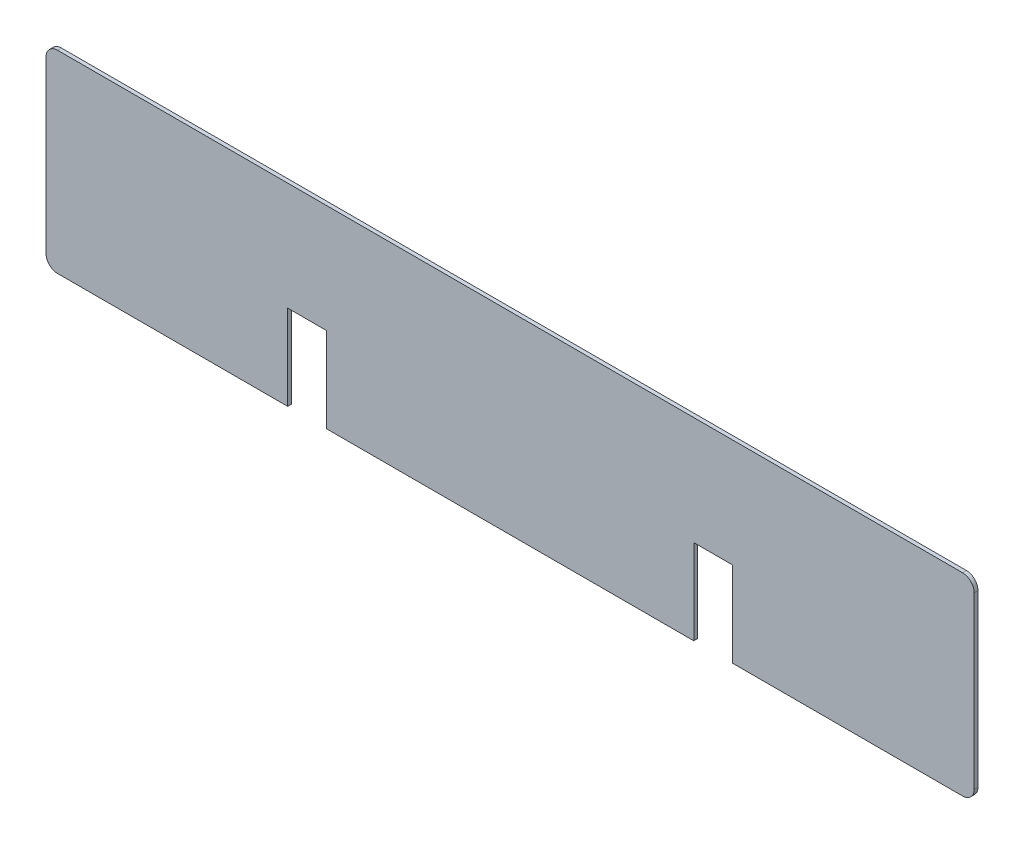
ISO-10303-21;
HEADER;
FILE_DESCRIPTION(('STEP AP214'),'2;1');
FILE_NAME('part.step','',(''),(''),'','','');
FILE_SCHEMA(('AUTOMOTIVE_DESIGN { 1 0 10303 214 1 1 1 1 }'));
ENDSEC;
DATA;
#1=APPLICATION_CONTEXT('core data for automotive mechanical design processes');
#2=APPLICATION_PROTOCOL_DEFINITION('international standard','automotive_design',2000,#1);
#3=PRODUCT_CONTEXT('',#1,'mechanical');
#4=PRODUCT('Part','Part','',(#3));
#5=PRODUCT_RELATED_PRODUCT_CATEGORY('part','',(#4));
#6=PRODUCT_DEFINITION_FORMATION('','',#4);
#7=PRODUCT_DEFINITION_CONTEXT('part definition',#1,'design');
#8=PRODUCT_DEFINITION('design','',#6,#7);
#9=PRODUCT_DEFINITION_SHAPE('','',#8);
#10=(LENGTH_UNIT() NAMED_UNIT(*) SI_UNIT(.MILLI.,.METRE.));
#11=(NAMED_UNIT(*) PLANE_ANGLE_UNIT() SI_UNIT($,.RADIAN.));
#12=(NAMED_UNIT(*) SI_UNIT($,.STERADIAN.) SOLID_ANGLE_UNIT());
#13=UNCERTAINTY_MEASURE_WITH_UNIT(LENGTH_MEASURE(1.E-05),#10,'distance_accuracy_value','');
#14=(GEOMETRIC_REPRESENTATION_CONTEXT(3) GLOBAL_UNCERTAINTY_ASSIGNED_CONTEXT((#13)) GLOBAL_UNIT_ASSIGNED_CONTEXT((#10,
#11,#12)) REPRESENTATION_CONTEXT('',''));
#15=CARTESIAN_POINT('',(0.,0.,0.));
#16=DIRECTION('',(0.,0.,1.));
#17=DIRECTION('',(1.,0.,0.));
#18=AXIS2_PLACEMENT_3D('',#15,#16,#17);
#19=CARTESIAN_POINT('',(-120.,-25.,1.));
#20=DIRECTION('',(0.,1.,0.));
#21=DIRECTION('',(0.,0.,1.));
#22=AXIS2_PLACEMENT_3D('',#19,#20,#21);
#23=PLANE('',#22);
#24=DIRECTION('',(1.,0.,0.));
#25=VECTOR('',#24,1.);
#26=CARTESIAN_POINT('',(-120.,-25.,1.));
#27=LINE('',#26,#25);
#28=CARTESIAN_POINT('',(-47.5,-25.,1.));
#29=VERTEX_POINT('',#28);
#30=CARTESIAN_POINT('',(47.5,-25.,1.));
#31=VERTEX_POINT('',#30);
#32=EDGE_CURVE('E227',#29,#31,#27,.T.);
#33=ORIENTED_EDGE('',*,*,#32,.F.);
#34=DIRECTION('',(0.,0.,1.));
#35=VECTOR('',#34,1.);
#36=CARTESIAN_POINT('',(-47.5,-25.,0.));
#37=LINE('',#36,#35);
#38=CARTESIAN_POINT('',(-47.5,-25.,0.));
#39=VERTEX_POINT('',#38);
#40=EDGE_CURVE('E182',#39,#29,#37,.T.);
#41=ORIENTED_EDGE('',*,*,#40,.F.);
#42=DIRECTION('',(1.,0.,0.));
#43=VECTOR('',#42,1.);
#44=CARTESIAN_POINT('',(-120.,-25.,0.));
#45=LINE('',#44,#43);
#46=CARTESIAN_POINT('',(47.5,-25.,0.));
#47=VERTEX_POINT('',#46);
#48=EDGE_CURVE('E172',#39,#47,#45,.T.);
#49=ORIENTED_EDGE('',*,*,#48,.T.);
#50=DIRECTION('',(0.,0.,1.));
#51=VECTOR('',#50,1.);
#52=CARTESIAN_POINT('',(47.5,-25.,0.));
#53=LINE('',#52,#51);
#54=EDGE_CURVE('E193',#47,#31,#53,.T.);
#55=ORIENTED_EDGE('',*,*,#54,.T.);
#56=EDGE_LOOP('',(#33,#41,#49,#55));
#57=FACE_BOUND('',#56,.T.);
#58=ADVANCED_FACE('F40',(#57),#23,.F.);
#59=CARTESIAN_POINT('',(57.5,-25.,1.));
#60=VERTEX_POINT('',#59);
#61=CARTESIAN_POINT('',(117.,-25.,1.));
#62=VERTEX_POINT('',#61);
#63=EDGE_CURVE('E222',#60,#62,#27,.T.);
#64=ORIENTED_EDGE('',*,*,#63,.F.);
#65=DIRECTION('',(0.,0.,1.));
#66=VECTOR('',#65,1.);
#67=CARTESIAN_POINT('',(57.5,-25.,0.));
#68=LINE('',#67,#66);
#69=CARTESIAN_POINT('',(57.5,-25.,0.));
#70=VERTEX_POINT('',#69);
#71=EDGE_CURVE('E196',#70,#60,#68,.T.);
#72=ORIENTED_EDGE('',*,*,#71,.F.);
#73=CARTESIAN_POINT('',(117.,-25.,0.));
#74=VERTEX_POINT('',#73);
#75=EDGE_CURVE('E236',#70,#74,#45,.T.);
#76=ORIENTED_EDGE('',*,*,#75,.T.);
#77=DIRECTION('',(0.,0.,-1.));
#78=VECTOR('',#77,1.);
#79=CARTESIAN_POINT('',(117.,-25.,1.));
#80=LINE('',#79,#78);
#81=EDGE_CURVE('E255',#74,#62,#80,.F.);
#82=ORIENTED_EDGE('',*,*,#81,.T.);
#83=EDGE_LOOP('',(#64,#72,#76,#82));
#84=FACE_BOUND('',#83,.T.);
#85=ADVANCED_FACE('F319',(#84),#23,.F.);
#86=CARTESIAN_POINT('',(120.,25.,1.));
#87=DIRECTION('',(-1.,0.,0.));
#88=DIRECTION('',(0.,0.,1.));
#89=AXIS2_PLACEMENT_3D('',#86,#87,#88);
#90=PLANE('',#89);
#91=DIRECTION('',(0.,1.,0.));
#92=VECTOR('',#91,1.);
#93=CARTESIAN_POINT('',(120.,25.,1.));
#94=LINE('',#93,#92);
#95=CARTESIAN_POINT('',(120.,-22.,1.));
#96=VERTEX_POINT('',#95);
#97=CARTESIAN_POINT('',(120.,22.,1.));
#98=VERTEX_POINT('',#97);
#99=EDGE_CURVE('E212',#96,#98,#94,.T.);
#100=ORIENTED_EDGE('',*,*,#99,.F.);
#101=DIRECTION('',(0.,0.,-1.));
#102=VECTOR('',#101,1.);
#103=CARTESIAN_POINT('',(120.,-22.,1.));
#104=LINE('',#103,#102);
#105=CARTESIAN_POINT('',(120.,-22.,0.));
#106=VERTEX_POINT('',#105);
#107=EDGE_CURVE('E240',#96,#106,#104,.T.);
#108=ORIENTED_EDGE('',*,*,#107,.T.);
#109=DIRECTION('',(0.,1.,0.));
#110=VECTOR('',#109,1.);
#111=CARTESIAN_POINT('',(120.,25.,0.));
#112=LINE('',#111,#110);
#113=CARTESIAN_POINT('',(120.,22.,0.));
#114=VERTEX_POINT('',#113);
#115=EDGE_CURVE('E184',#106,#114,#112,.T.);
#116=ORIENTED_EDGE('',*,*,#115,.T.);
#117=DIRECTION('',(0.,0.,-1.));
#118=VECTOR('',#117,1.);
#119=CARTESIAN_POINT('',(120.,22.,1.));
#120=LINE('',#119,#118);
#121=EDGE_CURVE('E226',#114,#98,#120,.F.);
#122=ORIENTED_EDGE('',*,*,#121,.T.);
#123=EDGE_LOOP('',(#100,#108,#116,#122));
#124=FACE_BOUND('',#123,.T.);
#125=ADVANCED_FACE('F301',(#124),#90,.F.);
#126=CARTESIAN_POINT('',(-120.,25.,1.));
#127=DIRECTION('',(0.,-1.,0.));
#128=DIRECTION('',(0.,0.,-1.));
#129=AXIS2_PLACEMENT_3D('',#126,#127,#128);
#130=PLANE('',#129);
#131=DIRECTION('',(-1.,0.,0.));
#132=VECTOR('',#131,1.);
#133=CARTESIAN_POINT('',(-120.,25.,1.));
#134=LINE('',#133,#132);
#135=CARTESIAN_POINT('',(117.,25.,1.));
#136=VERTEX_POINT('',#135);
#137=CARTESIAN_POINT('',(-117.,25.,1.));
#138=VERTEX_POINT('',#137);
#139=EDGE_CURVE('E215',#136,#138,#134,.T.);
#140=ORIENTED_EDGE('',*,*,#139,.F.);
#141=DIRECTION('',(0.,0.,-1.));
#142=VECTOR('',#141,1.);
#143=CARTESIAN_POINT('',(117.,25.,1.));
#144=LINE('',#143,#142);
#145=CARTESIAN_POINT('',(117.,25.,0.));
#146=VERTEX_POINT('',#145);
#147=EDGE_CURVE('E268',#136,#146,#144,.T.);
#148=ORIENTED_EDGE('',*,*,#147,.T.);
#149=DIRECTION('',(-1.,0.,0.));
#150=VECTOR('',#149,1.);
#151=CARTESIAN_POINT('',(-120.,25.,0.));
#152=LINE('',#151,#150);
#153=CARTESIAN_POINT('',(-117.,25.,0.));
#154=VERTEX_POINT('',#153);
#155=EDGE_CURVE('E230',#146,#154,#152,.T.);
#156=ORIENTED_EDGE('',*,*,#155,.T.);
#157=DIRECTION('',(0.,0.,-1.));
#158=VECTOR('',#157,1.);
#159=CARTESIAN_POINT('',(-117.,25.,1.));
#160=LINE('',#159,#158);
#161=EDGE_CURVE('E266',#154,#138,#160,.F.);
#162=ORIENTED_EDGE('',*,*,#161,.T.);
#163=EDGE_LOOP('',(#140,#148,#156,#162));
#164=FACE_BOUND('',#163,.T.);
#165=ADVANCED_FACE('F294',(#164),#130,.F.);
#166=CARTESIAN_POINT('',(-120.,25.,1.));
#167=DIRECTION('',(1.,0.,0.));
#168=DIRECTION('',(0.,0.,-1.));
#169=AXIS2_PLACEMENT_3D('',#166,#167,#168);
#170=PLANE('',#169);
#171=DIRECTION('',(0.,-1.,0.));
#172=VECTOR('',#171,1.);
#173=CARTESIAN_POINT('',(-120.,25.,0.));
#174=LINE('',#173,#172);
#175=CARTESIAN_POINT('',(-120.,22.,0.));
#176=VERTEX_POINT('',#175);
#177=CARTESIAN_POINT('',(-120.,-22.,0.));
#178=VERTEX_POINT('',#177);
#179=EDGE_CURVE('E233',#176,#178,#174,.T.);
#180=ORIENTED_EDGE('',*,*,#179,.T.);
#181=DIRECTION('',(0.,0.,-1.));
#182=VECTOR('',#181,1.);
#183=CARTESIAN_POINT('',(-120.,-22.,1.));
#184=LINE('',#183,#182);
#185=CARTESIAN_POINT('',(-120.,-22.,1.));
#186=VERTEX_POINT('',#185);
#187=EDGE_CURVE('E11',#178,#186,#184,.F.);
#188=ORIENTED_EDGE('',*,*,#187,.T.);
#189=DIRECTION('',(0.,-1.,0.));
#190=VECTOR('',#189,1.);
#191=CARTESIAN_POINT('',(-120.,25.,1.));
#192=LINE('',#191,#190);
#193=CARTESIAN_POINT('',(-120.,22.,1.));
#194=VERTEX_POINT('',#193);
#195=EDGE_CURVE('E219',#194,#186,#192,.T.);
#196=ORIENTED_EDGE('',*,*,#195,.F.);
#197=DIRECTION('',(0.,0.,-1.));
#198=VECTOR('',#197,1.);
#199=CARTESIAN_POINT('',(-120.,22.,1.));
#200=LINE('',#199,#198);
#201=EDGE_CURVE('E48',#194,#176,#200,.T.);
#202=ORIENTED_EDGE('',*,*,#201,.T.);
#203=EDGE_LOOP('',(#180,#188,#196,#202));
#204=FACE_BOUND('',#203,.T.);
#205=ADVANCED_FACE('F275',(#204),#170,.F.);
#206=CARTESIAN_POINT('',(-117.,-25.,0.));
#207=VERTEX_POINT('',#206);
#208=CARTESIAN_POINT('',(-57.5,-25.,0.));
#209=VERTEX_POINT('',#208);
#210=EDGE_CURVE('E216',#207,#209,#45,.T.);
#211=ORIENTED_EDGE('',*,*,#210,.T.);
#212=DIRECTION('',(0.,0.,1.));
#213=VECTOR('',#212,1.);
#214=CARTESIAN_POINT('',(-57.5,-25.,0.));
#215=LINE('',#214,#213);
#216=CARTESIAN_POINT('',(-57.5,-25.,1.));
#217=VERTEX_POINT('',#216);
#218=EDGE_CURVE('E185',#209,#217,#215,.T.);
#219=ORIENTED_EDGE('',*,*,#218,.T.);
#220=CARTESIAN_POINT('',(-117.,-25.,1.));
#221=VERTEX_POINT('',#220);
#222=EDGE_CURVE('E223',#221,#217,#27,.T.);
#223=ORIENTED_EDGE('',*,*,#222,.F.);
#224=DIRECTION('',(0.,0.,-1.));
#225=VECTOR('',#224,1.);
#226=CARTESIAN_POINT('',(-117.,-25.,1.));
#227=LINE('',#226,#225);
#228=EDGE_CURVE('E252',#221,#207,#227,.T.);
#229=ORIENTED_EDGE('',*,*,#228,.T.);
#230=EDGE_LOOP('',(#211,#219,#223,#229));
#231=FACE_BOUND('',#230,.T.);
#232=ADVANCED_FACE('F287',(#231),#23,.F.);
#233=CARTESIAN_POINT('',(0.,0.,1.));
#234=DIRECTION('',(0.,0.,1.));
#235=DIRECTION('',(1.,0.,0.));
#236=AXIS2_PLACEMENT_3D('',#233,#234,#235);
#237=PLANE('',#236);
#238=DIRECTION('',(0.,1.,0.));
#239=VECTOR('',#238,1.);
#240=CARTESIAN_POINT('',(-47.5,-3.,1.));
#241=LINE('',#240,#239);
#242=CARTESIAN_POINT('',(-47.5,-3.,1.));
#243=VERTEX_POINT('',#242);
#244=EDGE_CURVE('E158',#29,#243,#241,.T.);
#245=ORIENTED_EDGE('',*,*,#244,.F.);
#246=ORIENTED_EDGE('',*,*,#32,.T.);
#247=DIRECTION('',(0.,-1.,0.));
#248=VECTOR('',#247,1.);
#249=CARTESIAN_POINT('',(47.5,-3.,1.));
#250=LINE('',#249,#248);
#251=CARTESIAN_POINT('',(47.5,-3.,1.));
#252=VERTEX_POINT('',#251);
#253=EDGE_CURVE('E198',#252,#31,#250,.T.);
#254=ORIENTED_EDGE('',*,*,#253,.F.);
#255=DIRECTION('',(-1.,0.,0.));
#256=VECTOR('',#255,1.);
#257=CARTESIAN_POINT('',(47.5,-3.,1.));
#258=LINE('',#257,#256);
#259=CARTESIAN_POINT('',(57.5,-3.,1.));
#260=VERTEX_POINT('',#259);
#261=EDGE_CURVE('E200',#260,#252,#258,.T.);
#262=ORIENTED_EDGE('',*,*,#261,.F.);
#263=DIRECTION('',(0.,1.,0.));
#264=VECTOR('',#263,1.);
#265=CARTESIAN_POINT('',(57.5,-3.,1.));
#266=LINE('',#265,#264);
#267=EDGE_CURVE('E180',#60,#260,#266,.T.);
#268=ORIENTED_EDGE('',*,*,#267,.F.);
#269=ORIENTED_EDGE('',*,*,#63,.T.);
#270=CARTESIAN_POINT('',(117.,-22.,1.));
#271=DIRECTION('',(0.,0.,1.));
#272=DIRECTION('',(1.,0.,0.));
#273=AXIS2_PLACEMENT_3D('',#270,#271,#272);
#274=CIRCLE('',#273,3.);
#275=EDGE_CURVE('E264',#62,#96,#274,.T.);
#276=ORIENTED_EDGE('',*,*,#275,.T.);
#277=ORIENTED_EDGE('',*,*,#99,.T.);
#278=CARTESIAN_POINT('',(117.,22.,1.));
#279=DIRECTION('',(0.,0.,1.));
#280=DIRECTION('',(1.,0.,0.));
#281=AXIS2_PLACEMENT_3D('',#278,#279,#280);
#282=CIRCLE('',#281,3.);
#283=EDGE_CURVE('E262',#98,#136,#282,.T.);
#284=ORIENTED_EDGE('',*,*,#283,.T.);
#285=ORIENTED_EDGE('',*,*,#139,.T.);
#286=CARTESIAN_POINT('',(-117.,22.,1.));
#287=DIRECTION('',(0.,0.,1.));
#288=DIRECTION('',(1.,0.,0.));
#289=AXIS2_PLACEMENT_3D('',#286,#287,#288);
#290=CIRCLE('',#289,3.);
#291=EDGE_CURVE('E258',#138,#194,#290,.T.);
#292=ORIENTED_EDGE('',*,*,#291,.T.);
#293=ORIENTED_EDGE('',*,*,#195,.T.);
#294=CARTESIAN_POINT('',(-117.,-22.,1.));
#295=DIRECTION('',(0.,0.,1.));
#296=DIRECTION('',(1.,0.,0.));
#297=AXIS2_PLACEMENT_3D('',#294,#295,#296);
#298=CIRCLE('',#297,3.);
#299=EDGE_CURVE('E260',#186,#221,#298,.T.);
#300=ORIENTED_EDGE('',*,*,#299,.T.);
#301=ORIENTED_EDGE('',*,*,#222,.T.);
#302=DIRECTION('',(0.,-1.,0.));
#303=VECTOR('',#302,1.);
#304=CARTESIAN_POINT('',(-57.5,-3.,1.));
#305=LINE('',#304,#303);
#306=CARTESIAN_POINT('',(-57.5,-3.,1.));
#307=VERTEX_POINT('',#306);
#308=EDGE_CURVE('E173',#307,#217,#305,.T.);
#309=ORIENTED_EDGE('',*,*,#308,.F.);
#310=DIRECTION('',(-1.,0.,0.));
#311=VECTOR('',#310,1.);
#312=CARTESIAN_POINT('',(-57.5,-3.,1.));
#313=LINE('',#312,#311);
#314=EDGE_CURVE('E175',#243,#307,#313,.T.);
#315=ORIENTED_EDGE('',*,*,#314,.F.);
#316=EDGE_LOOP('',(#245,#246,#254,#262,#268,#269,#276,#277,#284,#285,#292,#293,#300,#301,#309,#315));
#317=FACE_BOUND('',#316,.T.);
#318=ADVANCED_FACE('F290',(#317),#237,.T.);
#319=CARTESIAN_POINT('',(0.,0.,0.));
#320=DIRECTION('',(0.,0.,1.));
#321=DIRECTION('',(1.,0.,0.));
#322=AXIS2_PLACEMENT_3D('',#319,#320,#321);
#323=PLANE('',#322);
#324=ORIENTED_EDGE('',*,*,#48,.F.);
#325=DIRECTION('',(0.,1.,0.));
#326=VECTOR('',#325,1.);
#327=CARTESIAN_POINT('',(-47.5,-3.,0.));
#328=LINE('',#327,#326);
#329=CARTESIAN_POINT('',(-47.5,-3.,0.));
#330=VERTEX_POINT('',#329);
#331=EDGE_CURVE('E155',#39,#330,#328,.T.);
#332=ORIENTED_EDGE('',*,*,#331,.T.);
#333=DIRECTION('',(-1.,0.,0.));
#334=VECTOR('',#333,1.);
#335=CARTESIAN_POINT('',(-57.5,-3.,0.));
#336=LINE('',#335,#334);
#337=CARTESIAN_POINT('',(-57.5,-3.,0.));
#338=VERTEX_POINT('',#337);
#339=EDGE_CURVE('E165',#330,#338,#336,.T.);
#340=ORIENTED_EDGE('',*,*,#339,.T.);
#341=DIRECTION('',(0.,-1.,0.));
#342=VECTOR('',#341,1.);
#343=CARTESIAN_POINT('',(-57.5,-3.,0.));
#344=LINE('',#343,#342);
#345=EDGE_CURVE('E55',#338,#209,#344,.T.);
#346=ORIENTED_EDGE('',*,*,#345,.T.);
#347=ORIENTED_EDGE('',*,*,#210,.F.);
#348=CARTESIAN_POINT('',(-117.,-22.,0.));
#349=DIRECTION('',(0.,0.,1.));
#350=DIRECTION('',(1.,0.,0.));
#351=AXIS2_PLACEMENT_3D('',#348,#349,#350);
#352=CIRCLE('',#351,3.);
#353=EDGE_CURVE('E245',#207,#178,#352,.F.);
#354=ORIENTED_EDGE('',*,*,#353,.T.);
#355=ORIENTED_EDGE('',*,*,#179,.F.);
#356=CARTESIAN_POINT('',(-117.,22.,0.));
#357=DIRECTION('',(0.,0.,1.));
#358=DIRECTION('',(1.,0.,0.));
#359=AXIS2_PLACEMENT_3D('',#356,#357,#358);
#360=CIRCLE('',#359,3.);
#361=EDGE_CURVE('E243',#176,#154,#360,.F.);
#362=ORIENTED_EDGE('',*,*,#361,.T.);
#363=ORIENTED_EDGE('',*,*,#155,.F.);
#364=CARTESIAN_POINT('',(117.,22.,0.));
#365=DIRECTION('',(0.,0.,1.));
#366=DIRECTION('',(1.,0.,0.));
#367=AXIS2_PLACEMENT_3D('',#364,#365,#366);
#368=CIRCLE('',#367,3.);
#369=EDGE_CURVE('E247',#146,#114,#368,.F.);
#370=ORIENTED_EDGE('',*,*,#369,.T.);
#371=ORIENTED_EDGE('',*,*,#115,.F.);
#372=CARTESIAN_POINT('',(117.,-22.,0.));
#373=DIRECTION('',(0.,0.,1.));
#374=DIRECTION('',(1.,0.,0.));
#375=AXIS2_PLACEMENT_3D('',#372,#373,#374);
#376=CIRCLE('',#375,3.);
#377=EDGE_CURVE('E249',#106,#74,#376,.F.);
#378=ORIENTED_EDGE('',*,*,#377,.T.);
#379=ORIENTED_EDGE('',*,*,#75,.F.);
#380=DIRECTION('',(0.,1.,0.));
#381=VECTOR('',#380,1.);
#382=CARTESIAN_POINT('',(57.5,-3.,0.));
#383=LINE('',#382,#381);
#384=CARTESIAN_POINT('',(57.5,-3.,0.));
#385=VERTEX_POINT('',#384);
#386=EDGE_CURVE('E201',#70,#385,#383,.T.);
#387=ORIENTED_EDGE('',*,*,#386,.T.);
#388=DIRECTION('',(-1.,0.,0.));
#389=VECTOR('',#388,1.);
#390=CARTESIAN_POINT('',(47.5,-3.,0.));
#391=LINE('',#390,#389);
#392=CARTESIAN_POINT('',(47.5,-3.,0.));
#393=VERTEX_POINT('',#392);
#394=EDGE_CURVE('E207',#385,#393,#391,.T.);
#395=ORIENTED_EDGE('',*,*,#394,.T.);
#396=DIRECTION('',(0.,-1.,0.));
#397=VECTOR('',#396,1.);
#398=CARTESIAN_POINT('',(47.5,-3.,0.));
#399=LINE('',#398,#397);
#400=EDGE_CURVE('E63',#393,#47,#399,.T.);
#401=ORIENTED_EDGE('',*,*,#400,.T.);
#402=EDGE_LOOP('',(#324,#332,#340,#346,#347,#354,#355,#362,#363,#370,#371,#378,#379,#387,#395,#401));
#403=FACE_BOUND('',#402,.T.);
#404=ADVANCED_FACE('F170',(#403),#323,.F.);
#405=CARTESIAN_POINT('',(117.,-22.,1.));
#406=DIRECTION('',(0.,0.,-1.));
#407=DIRECTION('',(-1.,0.,0.));
#408=AXIS2_PLACEMENT_3D('',#405,#406,#407);
#409=CYLINDRICAL_SURFACE('',#408,3.);
#410=ORIENTED_EDGE('',*,*,#275,.F.);
#411=ORIENTED_EDGE('',*,*,#81,.F.);
#412=ORIENTED_EDGE('',*,*,#377,.F.);
#413=ORIENTED_EDGE('',*,*,#107,.F.);
#414=EDGE_LOOP('',(#410,#411,#412,#413));
#415=FACE_BOUND('',#414,.T.);
#416=ADVANCED_FACE('F307',(#415),#409,.T.);
#417=CARTESIAN_POINT('',(117.,22.,1.));
#418=DIRECTION('',(0.,0.,-1.));
#419=DIRECTION('',(-1.,0.,0.));
#420=AXIS2_PLACEMENT_3D('',#417,#418,#419);
#421=CYLINDRICAL_SURFACE('',#420,3.);
#422=ORIENTED_EDGE('',*,*,#283,.F.);
#423=ORIENTED_EDGE('',*,*,#121,.F.);
#424=ORIENTED_EDGE('',*,*,#369,.F.);
#425=ORIENTED_EDGE('',*,*,#147,.F.);
#426=EDGE_LOOP('',(#422,#423,#424,#425));
#427=FACE_BOUND('',#426,.T.);
#428=ADVANCED_FACE('F304',(#427),#421,.T.);
#429=CARTESIAN_POINT('',(-117.,-22.,1.));
#430=DIRECTION('',(0.,0.,-1.));
#431=DIRECTION('',(-1.,0.,0.));
#432=AXIS2_PLACEMENT_3D('',#429,#430,#431);
#433=CYLINDRICAL_SURFACE('',#432,3.);
#434=ORIENTED_EDGE('',*,*,#299,.F.);
#435=ORIENTED_EDGE('',*,*,#187,.F.);
#436=ORIENTED_EDGE('',*,*,#353,.F.);
#437=ORIENTED_EDGE('',*,*,#228,.F.);
#438=EDGE_LOOP('',(#434,#435,#436,#437));
#439=FACE_BOUND('',#438,.T.);
#440=ADVANCED_FACE('F284',(#439),#433,.T.);
#441=CARTESIAN_POINT('',(-117.,22.,1.));
#442=DIRECTION('',(0.,0.,-1.));
#443=DIRECTION('',(-1.,0.,0.));
#444=AXIS2_PLACEMENT_3D('',#441,#442,#443);
#445=CYLINDRICAL_SURFACE('',#444,3.);
#446=ORIENTED_EDGE('',*,*,#291,.F.);
#447=ORIENTED_EDGE('',*,*,#161,.F.);
#448=ORIENTED_EDGE('',*,*,#361,.F.);
#449=ORIENTED_EDGE('',*,*,#201,.F.);
#450=EDGE_LOOP('',(#446,#447,#448,#449));
#451=FACE_BOUND('',#450,.T.);
#452=ADVANCED_FACE('F42',(#451),#445,.T.);
#453=CARTESIAN_POINT('',(57.5,-3.,0.));
#454=DIRECTION('',(1.,0.,0.));
#455=DIRECTION('',(0.,0.,-1.));
#456=AXIS2_PLACEMENT_3D('',#453,#454,#455);
#457=PLANE('',#456);
#458=ORIENTED_EDGE('',*,*,#267,.T.);
#459=DIRECTION('',(0.,0.,1.));
#460=VECTOR('',#459,1.);
#461=CARTESIAN_POINT('',(57.5,-3.,0.));
#462=LINE('',#461,#460);
#463=EDGE_CURVE('E189',#385,#260,#462,.T.);
#464=ORIENTED_EDGE('',*,*,#463,.F.);
#465=ORIENTED_EDGE('',*,*,#386,.F.);
#466=ORIENTED_EDGE('',*,*,#71,.T.);
#467=EDGE_LOOP('',(#458,#464,#465,#466));
#468=FACE_BOUND('',#467,.T.);
#469=ADVANCED_FACE('F348',(#468),#457,.F.);
#470=CARTESIAN_POINT('',(47.5,-3.,0.));
#471=DIRECTION('',(-1.,0.,0.));
#472=DIRECTION('',(0.,0.,1.));
#473=AXIS2_PLACEMENT_3D('',#470,#471,#472);
#474=PLANE('',#473);
#475=ORIENTED_EDGE('',*,*,#253,.T.);
#476=ORIENTED_EDGE('',*,*,#54,.F.);
#477=ORIENTED_EDGE('',*,*,#400,.F.);
#478=DIRECTION('',(0.,0.,1.));
#479=VECTOR('',#478,1.);
#480=CARTESIAN_POINT('',(47.5,-3.,0.));
#481=LINE('',#480,#479);
#482=EDGE_CURVE('E191',#393,#252,#481,.T.);
#483=ORIENTED_EDGE('',*,*,#482,.T.);
#484=EDGE_LOOP('',(#475,#476,#477,#483));
#485=FACE_BOUND('',#484,.T.);
#486=ADVANCED_FACE('F353',(#485),#474,.F.);
#487=CARTESIAN_POINT('',(47.5,-3.,0.));
#488=DIRECTION('',(0.,1.,0.));
#489=DIRECTION('',(0.,0.,1.));
#490=AXIS2_PLACEMENT_3D('',#487,#488,#489);
#491=PLANE('',#490);
#492=ORIENTED_EDGE('',*,*,#261,.T.);
#493=ORIENTED_EDGE('',*,*,#482,.F.);
#494=ORIENTED_EDGE('',*,*,#394,.F.);
#495=ORIENTED_EDGE('',*,*,#463,.T.);
#496=EDGE_LOOP('',(#492,#493,#494,#495));
#497=FACE_BOUND('',#496,.T.);
#498=ADVANCED_FACE('F360',(#497),#491,.F.);
#499=CARTESIAN_POINT('',(-47.5,-3.,0.));
#500=DIRECTION('',(1.,0.,0.));
#501=DIRECTION('',(0.,0.,-1.));
#502=AXIS2_PLACEMENT_3D('',#499,#500,#501);
#503=PLANE('',#502);
#504=ORIENTED_EDGE('',*,*,#244,.T.);
#505=DIRECTION('',(0.,0.,1.));
#506=VECTOR('',#505,1.);
#507=CARTESIAN_POINT('',(-47.5,-3.,0.));
#508=LINE('',#507,#506);
#509=EDGE_CURVE('E151',#330,#243,#508,.T.);
#510=ORIENTED_EDGE('',*,*,#509,.F.);
#511=ORIENTED_EDGE('',*,*,#331,.F.);
#512=ORIENTED_EDGE('',*,*,#40,.T.);
#513=EDGE_LOOP('',(#504,#510,#511,#512));
#514=FACE_BOUND('',#513,.T.);
#515=ADVANCED_FACE('F153',(#514),#503,.F.);
#516=CARTESIAN_POINT('',(-57.5,-3.,0.));
#517=DIRECTION('',(-1.,0.,0.));
#518=DIRECTION('',(0.,0.,1.));
#519=AXIS2_PLACEMENT_3D('',#516,#517,#518);
#520=PLANE('',#519);
#521=ORIENTED_EDGE('',*,*,#308,.T.);
#522=ORIENTED_EDGE('',*,*,#218,.F.);
#523=ORIENTED_EDGE('',*,*,#345,.F.);
#524=DIRECTION('',(0.,0.,1.));
#525=VECTOR('',#524,1.);
#526=CARTESIAN_POINT('',(-57.5,-3.,0.));
#527=LINE('',#526,#525);
#528=EDGE_CURVE('E162',#338,#307,#527,.T.);
#529=ORIENTED_EDGE('',*,*,#528,.T.);
#530=EDGE_LOOP('',(#521,#522,#523,#529));
#531=FACE_BOUND('',#530,.T.);
#532=ADVANCED_FACE('F399',(#531),#520,.F.);
#533=CARTESIAN_POINT('',(-57.5,-3.,0.));
#534=DIRECTION('',(0.,1.,0.));
#535=DIRECTION('',(0.,0.,1.));
#536=AXIS2_PLACEMENT_3D('',#533,#534,#535);
#537=PLANE('',#536);
#538=ORIENTED_EDGE('',*,*,#314,.T.);
#539=ORIENTED_EDGE('',*,*,#528,.F.);
#540=ORIENTED_EDGE('',*,*,#339,.F.);
#541=ORIENTED_EDGE('',*,*,#509,.T.);
#542=EDGE_LOOP('',(#538,#539,#540,#541));
#543=FACE_BOUND('',#542,.T.);
#544=ADVANCED_FACE('F166',(#543),#537,.F.);
#545=CLOSED_SHELL('',(#58,#85,#125,#165,#205,#232,#318,#404,#416,#428,#440,#452,#469,#486,#498,
#515,#532,#544));
#546=MANIFOLD_SOLID_BREP('B2',#545);
#547=ADVANCED_BREP_SHAPE_REPRESENTATION('',(#18,#546),#14);
#548=SHAPE_DEFINITION_REPRESENTATION(#9,#547);
ENDSEC;
END-ISO-10303-21;
